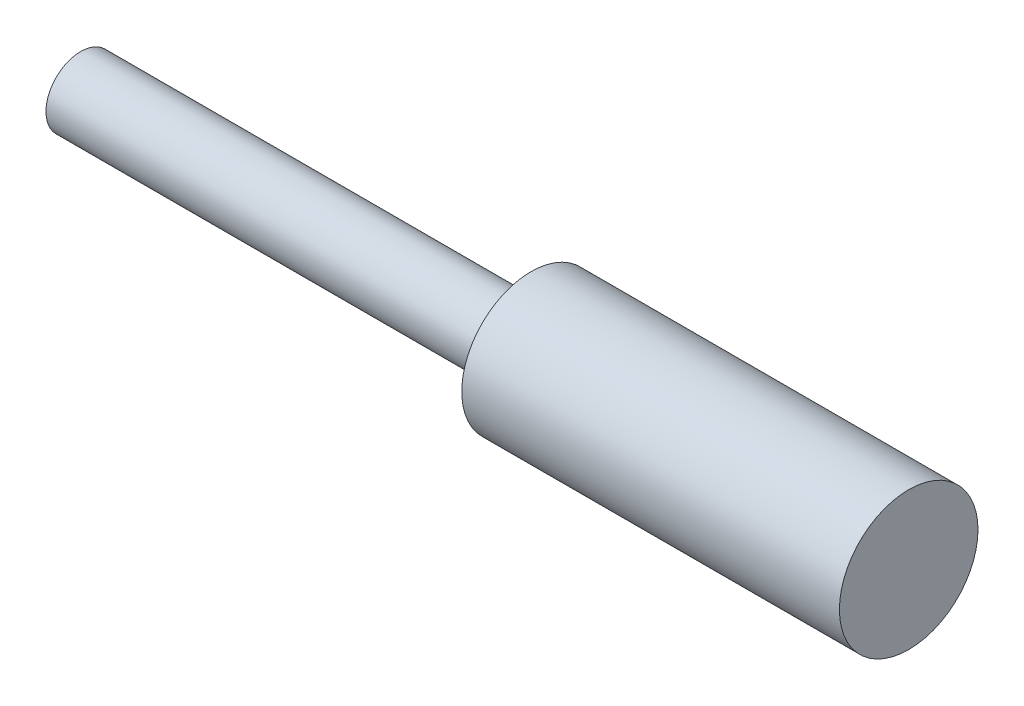
ISO-10303-21;
HEADER;
FILE_DESCRIPTION(('STEP AP214'),'2;1');
FILE_NAME('part.step','',(''),(''),'','','');
FILE_SCHEMA(('AUTOMOTIVE_DESIGN { 1 0 10303 214 1 1 1 1 }'));
ENDSEC;
DATA;
#1=APPLICATION_CONTEXT('core data for automotive mechanical design processes');
#2=APPLICATION_PROTOCOL_DEFINITION('international standard','automotive_design',2000,#1);
#3=PRODUCT_CONTEXT('',#1,'mechanical');
#4=PRODUCT('Part','Part','',(#3));
#5=PRODUCT_RELATED_PRODUCT_CATEGORY('part','',(#4));
#6=PRODUCT_DEFINITION_FORMATION('','',#4);
#7=PRODUCT_DEFINITION_CONTEXT('part definition',#1,'design');
#8=PRODUCT_DEFINITION('design','',#6,#7);
#9=PRODUCT_DEFINITION_SHAPE('','',#8);
#10=(LENGTH_UNIT() NAMED_UNIT(*) SI_UNIT(.MILLI.,.METRE.));
#11=(NAMED_UNIT(*) PLANE_ANGLE_UNIT() SI_UNIT($,.RADIAN.));
#12=(NAMED_UNIT(*) SI_UNIT($,.STERADIAN.) SOLID_ANGLE_UNIT());
#13=UNCERTAINTY_MEASURE_WITH_UNIT(LENGTH_MEASURE(1.E-05),#10,'distance_accuracy_value','');
#14=(GEOMETRIC_REPRESENTATION_CONTEXT(3) GLOBAL_UNCERTAINTY_ASSIGNED_CONTEXT((#13)) GLOBAL_UNIT_ASSIGNED_CONTEXT((#10,
#11,#12)) REPRESENTATION_CONTEXT('',''));
#15=CARTESIAN_POINT('',(0.,0.,0.));
#16=DIRECTION('',(0.,0.,1.));
#17=DIRECTION('',(1.,0.,0.));
#18=AXIS2_PLACEMENT_3D('',#15,#16,#17);
#19=CARTESIAN_POINT('',(2737.92363878348,11.5,22.5744));
#20=DIRECTION('',(-1.,0.,0.));
#21=DIRECTION('',(0.,0.,1.));
#22=AXIS2_PLACEMENT_3D('',#19,#20,#21);
#23=CYLINDRICAL_SURFACE('',#22,3.);
#24=CARTESIAN_POINT('',(2657.73835740924,11.5,22.5744));
#25=DIRECTION('',(-1.,0.,0.));
#26=DIRECTION('',(0.,0.,1.));
#27=AXIS2_PLACEMENT_3D('',#24,#25,#26);
#28=CIRCLE('',#27,3.);
#29=CARTESIAN_POINT('',(2657.73835740924,11.5,25.5744));
#30=VERTEX_POINT('',#29);
#31=EDGE_CURVE('E10',#30,#30,#28,.T.);
#32=ORIENTED_EDGE('',*,*,#31,.F.);
#33=EDGE_LOOP('',(#32));
#34=FACE_BOUND('',#33,.T.);
#35=CARTESIAN_POINT('',(2696.73835740924,11.5,22.5744));
#36=DIRECTION('',(1.,0.,0.));
#37=DIRECTION('',(0.,0.,-1.));
#38=AXIS2_PLACEMENT_3D('',#35,#36,#37);
#39=CIRCLE('',#38,3.);
#40=CARTESIAN_POINT('',(2696.73835740924,11.5,19.5744));
#41=VERTEX_POINT('',#40);
#42=EDGE_CURVE('E32',#41,#41,#39,.F.);
#43=ORIENTED_EDGE('',*,*,#42,.T.);
#44=EDGE_LOOP('',(#43));
#45=FACE_BOUND('',#44,.T.);
#46=ADVANCED_FACE('F29',(#34,#45),#23,.T.);
#47=CARTESIAN_POINT('',(2657.73835740924,11.5,22.5744));
#48=DIRECTION('',(-1.,0.,0.));
#49=DIRECTION('',(0.,0.,1.));
#50=AXIS2_PLACEMENT_3D('',#47,#48,#49);
#51=PLANE('',#50);
#52=ORIENTED_EDGE('',*,*,#31,.T.);
#53=EDGE_LOOP('',(#52));
#54=FACE_BOUND('',#53,.T.);
#55=ADVANCED_FACE('F60',(#54),#51,.T.);
#56=CARTESIAN_POINT('',(2679.76779466076,11.5,22.5744));
#57=DIRECTION('',(1.,0.,0.));
#58=DIRECTION('',(0.,0.,-1.));
#59=AXIS2_PLACEMENT_3D('',#56,#57,#58);
#60=CYLINDRICAL_SURFACE('',#59,5.99999999999999);
#61=CARTESIAN_POINT('',(2696.73835740924,11.5,22.5744));
#62=DIRECTION('',(1.,0.,0.));
#63=DIRECTION('',(0.,0.,-1.));
#64=AXIS2_PLACEMENT_3D('',#61,#62,#63);
#65=CIRCLE('',#64,5.99999999999999);
#66=CARTESIAN_POINT('',(2696.73835740924,11.5,16.5744));
#67=VERTEX_POINT('',#66);
#68=EDGE_CURVE('E39',#67,#67,#65,.T.);
#69=ORIENTED_EDGE('',*,*,#68,.T.);
#70=EDGE_LOOP('',(#69));
#71=FACE_BOUND('',#70,.T.);
#72=CARTESIAN_POINT('',(2729.43835740924,11.5,22.5744));
#73=DIRECTION('',(-1.,0.,0.));
#74=DIRECTION('',(0.,0.,1.));
#75=AXIS2_PLACEMENT_3D('',#72,#73,#74);
#76=CIRCLE('',#75,5.99999999999999);
#77=CARTESIAN_POINT('',(2729.43835740924,11.5,28.5744));
#78=VERTEX_POINT('',#77);
#79=EDGE_CURVE('E43',#78,#78,#76,.T.);
#80=ORIENTED_EDGE('',*,*,#79,.T.);
#81=EDGE_LOOP('',(#80));
#82=FACE_BOUND('',#81,.T.);
#83=ADVANCED_FACE('F47',(#71,#82),#60,.T.);
#84=CARTESIAN_POINT('',(2696.73835740924,11.5,11.5));
#85=DIRECTION('',(1.,0.,0.));
#86=DIRECTION('',(0.,0.,-1.));
#87=AXIS2_PLACEMENT_3D('',#84,#85,#86);
#88=PLANE('',#87);
#89=ORIENTED_EDGE('',*,*,#42,.F.);
#90=EDGE_LOOP('',(#89));
#91=FACE_BOUND('',#90,.T.);
#92=ORIENTED_EDGE('',*,*,#68,.F.);
#93=EDGE_LOOP('',(#92));
#94=FACE_BOUND('',#93,.T.);
#95=ADVANCED_FACE('F51',(#91,#94),#88,.F.);
#96=CARTESIAN_POINT('',(2729.43835740924,11.5,11.5));
#97=DIRECTION('',(-1.,0.,0.));
#98=DIRECTION('',(0.,0.,1.));
#99=AXIS2_PLACEMENT_3D('',#96,#97,#98);
#100=PLANE('',#99);
#101=ORIENTED_EDGE('',*,*,#79,.F.);
#102=EDGE_LOOP('',(#101));
#103=FACE_BOUND('',#102,.T.);
#104=ADVANCED_FACE('F49',(#103),#100,.F.);
#105=CLOSED_SHELL('',(#46,#55,#83,#95,#104));
#106=MANIFOLD_SOLID_BREP('B2',#105);
#107=ADVANCED_BREP_SHAPE_REPRESENTATION('',(#18,#106),#14);
#108=SHAPE_DEFINITION_REPRESENTATION(#9,#107);
ENDSEC;
END-ISO-10303-21;
